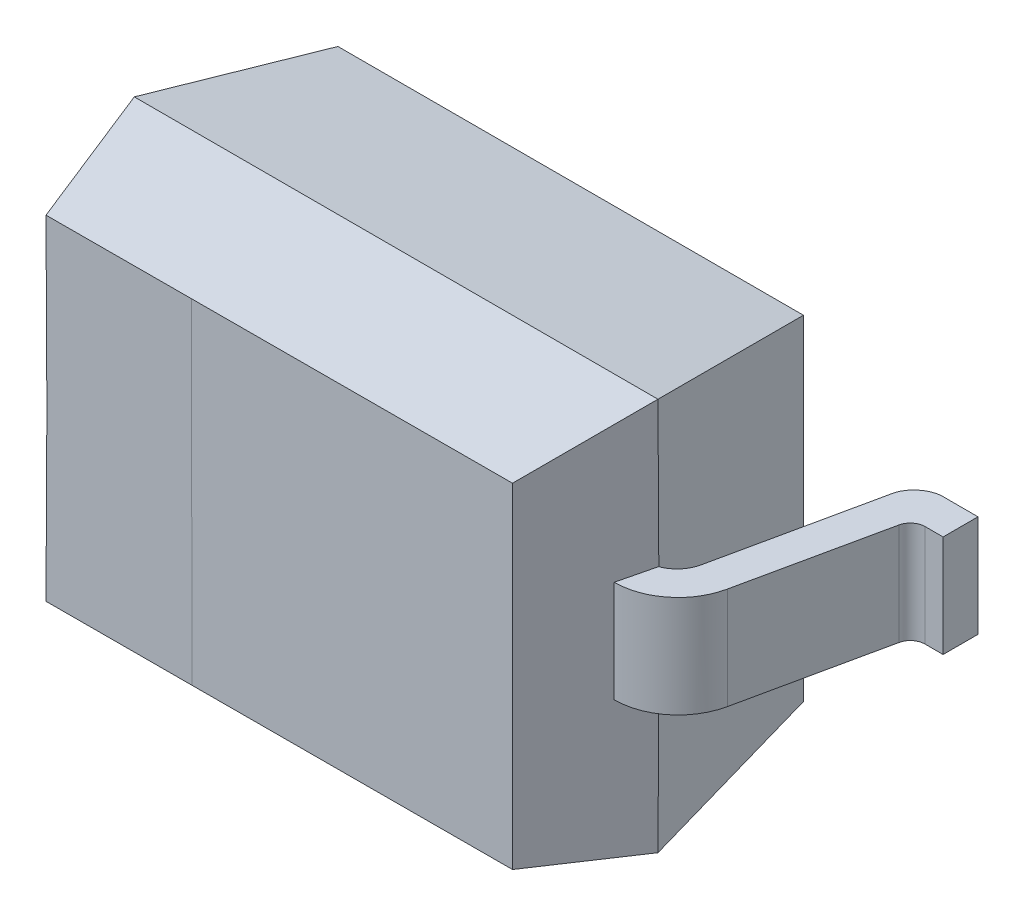
ISO-10303-21;
HEADER;
FILE_DESCRIPTION(('STEP AP214'),'2;1');
FILE_NAME('part.step','',(''),(''),'','','');
FILE_SCHEMA(('AUTOMOTIVE_DESIGN { 1 0 10303 214 1 1 1 1 }'));
ENDSEC;
DATA;
#1=APPLICATION_CONTEXT('core data for automotive mechanical design processes');
#2=APPLICATION_PROTOCOL_DEFINITION('international standard','automotive_design',2000,#1);
#3=PRODUCT_CONTEXT('',#1,'mechanical');
#4=PRODUCT('Part','Part','',(#3));
#5=PRODUCT_RELATED_PRODUCT_CATEGORY('part','',(#4));
#6=PRODUCT_DEFINITION_FORMATION('','',#4);
#7=PRODUCT_DEFINITION_CONTEXT('part definition',#1,'design');
#8=PRODUCT_DEFINITION('design','',#6,#7);
#9=PRODUCT_DEFINITION_SHAPE('','',#8);
#10=(LENGTH_UNIT() NAMED_UNIT(*) SI_UNIT(.MILLI.,.METRE.));
#11=(NAMED_UNIT(*) PLANE_ANGLE_UNIT() SI_UNIT($,.RADIAN.));
#12=(NAMED_UNIT(*) SI_UNIT($,.STERADIAN.) SOLID_ANGLE_UNIT());
#13=UNCERTAINTY_MEASURE_WITH_UNIT(LENGTH_MEASURE(1.E-05),#10,'distance_accuracy_value','');
#14=(GEOMETRIC_REPRESENTATION_CONTEXT(3) GLOBAL_UNCERTAINTY_ASSIGNED_CONTEXT((#13)) GLOBAL_UNIT_ASSIGNED_CONTEXT((#10,
#11,#12)) REPRESENTATION_CONTEXT('',''));
#15=CARTESIAN_POINT('',(0.,0.,0.));
#16=DIRECTION('',(0.,0.,1.));
#17=DIRECTION('',(1.,0.,0.));
#18=AXIS2_PLACEMENT_3D('',#15,#16,#17);
#19=CARTESIAN_POINT('',(0.,-0.543243243287611,-0.0905405405479329));
#20=DIRECTION('',(0.,0.986393923832144,0.164398987305358));
#21=DIRECTION('',(0.,-0.164398987305358,0.986393923832144));
#22=AXIS2_PLACEMENT_3D('',#19,#20,#21);
#23=PLANE('',#22);
#24=DIRECTION('',(1.,0.,0.));
#25=VECTOR('',#24,1.);
#26=CARTESIAN_POINT('',(0.,-0.575000000044456,0.0999999999931358));
#27=LINE('',#26,#25);
#28=CARTESIAN_POINT('',(0.799999999996665,-0.575000000042866,0.0999999999954248));
#29=VERTEX_POINT('',#28);
#30=CARTESIAN_POINT('',(-0.79999999999424,-0.575000000044456,0.0999999999954248));
#31=VERTEX_POINT('',#30);
#32=EDGE_CURVE('E193',#29,#31,#27,.F.);
#33=ORIENTED_EDGE('',*,*,#32,.F.);
#34=DIRECTION('',(-0.162221421363378,0.162221421124476,-0.973328526746854));
#35=VECTOR('',#34,1.);
#36=CARTESIAN_POINT('',(0.900000000150323,-0.675000000050845,0.700000000031467));
#37=LINE('',#36,#35);
#38=CARTESIAN_POINT('',(0.90000000016731,-0.675000000035285,0.700000000057761));
#39=VERTEX_POINT('',#38);
#40=EDGE_CURVE('E197',#39,#29,#37,.T.);
#41=ORIENTED_EDGE('',*,*,#40,.F.);
#42=DIRECTION('',(1.,0.,0.));
#43=VECTOR('',#42,1.);
#44=CARTESIAN_POINT('',(0.,-0.675000000027232,0.700000000025068));
#45=LINE('',#44,#43);
#46=CARTESIAN_POINT('',(-0.900000000179973,-0.675000000033437,0.700000000059475));
#47=VERTEX_POINT('',#46);
#48=EDGE_CURVE('E643',#47,#39,#45,.T.);
#49=ORIENTED_EDGE('',*,*,#48,.F.);
#50=DIRECTION('',(-0.162221421285356,-0.162221421126585,0.973328526759506));
#51=VECTOR('',#50,1.);
#52=CARTESIAN_POINT('',(-0.79999999999672,-0.57500000004486,0.0999999999955573));
#53=LINE('',#52,#51);
#54=EDGE_CURVE('E200',#31,#47,#53,.T.);
#55=ORIENTED_EDGE('',*,*,#54,.F.);
#56=EDGE_LOOP('',(#33,#41,#49,#55));
#57=FACE_BOUND('',#56,.T.);
#58=ADVANCED_FACE('F17',(#57),#23,.F.);
#59=CARTESIAN_POINT('',(-1.18084157899997,-0.174999999999953,0.100000000000038));
#60=DIRECTION('',(0.,1.,0.));
#61=DIRECTION('',(0.,0.,1.));
#62=AXIS2_PLACEMENT_3D('',#59,#60,#61);
#63=CYLINDRICAL_SURFACE('',#62,0.0999999996006633);
#64=CARTESIAN_POINT('',(-1.08306133768186,0.175000000000008,0.079047091083792));
#65=CARTESIAN_POINT('',(-1.09010125696182,0.175000000000008,0.0461941357109209));
#66=CARTESIAN_POINT('',(-1.1185163877309,0.175000000000008,0.0229045349440526));
#67=CARTESIAN_POINT('',(-1.14646170771199,0.175000000000008,3.51165589120538E-10));
#68=CARTESIAN_POINT('',(-1.18084157900002,0.175000000000008,1.99715244342258E-10));
#69=B_SPLINE_CURVE_WITH_KNOTS('',2,(#64,#65,#66,#67,#68),.UNSPECIFIED.,.F.,.F.,(3,2,3),(0.,0.5,
1.),.UNSPECIFIED.);
#70=CARTESIAN_POINT('',(-1.08306133762267,0.175000000000022,0.0790470910711083));
#71=VERTEX_POINT('',#70);
#72=CARTESIAN_POINT('',(-1.180841579,0.175000000000022,1.9970117681907E-10));
#73=VERTEX_POINT('',#72);
#74=EDGE_CURVE('E1323',#71,#73,#69,.T.);
#75=ORIENTED_EDGE('',*,*,#74,.F.);
#76=DIRECTION('',(0.,1.,0.));
#77=VECTOR('',#76,1.);
#78=CARTESIAN_POINT('',(-1.08306133713148,0.,0.0790470909658532));
#79=LINE('',#78,#77);
#80=CARTESIAN_POINT('',(-1.08306133762249,-0.174999999999995,0.0790470910710632));
#81=VERTEX_POINT('',#80);
#82=EDGE_CURVE('E645',#71,#81,#79,.F.);
#83=ORIENTED_EDGE('',*,*,#82,.T.);
#84=CARTESIAN_POINT('',(-1.18084157899997,-0.175000000000008,0.100000000000038));
#85=DIRECTION('',(0.,1.,0.));
#86=DIRECTION('',(0.977802413949638,0.,-0.209529089327143));
#87=AXIS2_PLACEMENT_3D('',#84,#85,#86);
#88=CIRCLE('',#87,0.0999999996006633);
#89=CARTESIAN_POINT('',(-1.18084157899997,-0.174999999999995,1.99496479448905E-10));
#90=VERTEX_POINT('',#89);
#91=EDGE_CURVE('E761',#81,#90,#88,.T.);
#92=ORIENTED_EDGE('',*,*,#91,.T.);
#93=DIRECTION('',(0.,1.,0.));
#94=VECTOR('',#93,1.);
#95=CARTESIAN_POINT('',(-1.18084157900002,0.,0.));
#96=LINE('',#95,#94);
#97=EDGE_CURVE('E223',#73,#90,#96,.F.);
#98=ORIENTED_EDGE('',*,*,#97,.F.);
#99=EDGE_LOOP('',(#75,#83,#92,#98));
#100=FACE_BOUND('',#99,.T.);
#101=ADVANCED_FACE('F652',(#100),#63,.T.);
#102=CARTESIAN_POINT('',(0.,0.,0.));
#103=DIRECTION('',(0.,0.,-1.));
#104=DIRECTION('',(0.,1.,0.));
#105=AXIS2_PLACEMENT_3D('',#102,#103,#104);
#106=PLANE('',#105);
#107=DIRECTION('',(1.,0.,0.));
#108=VECTOR('',#107,1.);
#109=CARTESIAN_POINT('',(0.,0.175000000000008,1.99715244342258E-10));
#110=LINE('',#109,#108);
#111=CARTESIAN_POINT('',(-1.30000000000001,0.175000000000027,1.33145809192807E-10));
#112=VERTEX_POINT('',#111);
#113=EDGE_CURVE('E755',#73,#112,#110,.F.);
#114=ORIENTED_EDGE('',*,*,#113,.F.);
#115=ORIENTED_EDGE('',*,*,#97,.T.);
#116=DIRECTION('',(1.,0.,0.));
#117=VECTOR('',#116,1.);
#118=CARTESIAN_POINT('',(0.,-0.174999999999981,1.99305849601927E-10));
#119=LINE('',#118,#117);
#120=CARTESIAN_POINT('',(-1.29999999999997,-0.174999999999981,1.3287287936592E-10));
#121=VERTEX_POINT('',#120);
#122=EDGE_CURVE('E742',#90,#121,#119,.F.);
#123=ORIENTED_EDGE('',*,*,#122,.T.);
#124=DIRECTION('',(0.,1.,0.));
#125=VECTOR('',#124,1.);
#126=CARTESIAN_POINT('',(-1.30000000000001,0.,0.));
#127=LINE('',#126,#125);
#128=EDGE_CURVE('E735',#121,#112,#127,.T.);
#129=ORIENTED_EDGE('',*,*,#128,.T.);
#130=EDGE_LOOP('',(#114,#115,#123,#129));
#131=FACE_BOUND('',#130,.T.);
#132=ADVANCED_FACE('F661',(#131),#106,.T.);
#133=CARTESIAN_POINT('',(-1.30000000000001,0.,0.));
#134=DIRECTION('',(1.,0.,0.));
#135=DIRECTION('',(0.,1.,0.));
#136=AXIS2_PLACEMENT_3D('',#133,#134,#135);
#137=PLANE('',#136);
#138=DIRECTION('',(0.,-1.,0.));
#139=VECTOR('',#138,1.);
#140=CARTESIAN_POINT('',(-1.29999999999998,0.,0.119999999999995));
#141=LINE('',#140,#139);
#142=CARTESIAN_POINT('',(-1.3,0.175000000000018,0.120000000000012));
#143=VERTEX_POINT('',#142);
#144=CARTESIAN_POINT('',(-1.29999999999996,-0.174999999999981,0.120000000000009));
#145=VERTEX_POINT('',#144);
#146=EDGE_CURVE('E731',#143,#145,#141,.T.);
#147=ORIENTED_EDGE('',*,*,#146,.F.);
#148=DIRECTION('',(0.,0.,1.));
#149=VECTOR('',#148,1.);
#150=CARTESIAN_POINT('',(-1.30000000000001,0.175000000000008,0.));
#151=LINE('',#150,#149);
#152=EDGE_CURVE('E703',#112,#143,#151,.T.);
#153=ORIENTED_EDGE('',*,*,#152,.F.);
#154=ORIENTED_EDGE('',*,*,#128,.F.);
#155=DIRECTION('',(0.,0.,1.));
#156=VECTOR('',#155,1.);
#157=CARTESIAN_POINT('',(-1.29999999999995,-0.174999999999981,0.));
#158=LINE('',#157,#156);
#159=EDGE_CURVE('E738',#121,#145,#158,.T.);
#160=ORIENTED_EDGE('',*,*,#159,.T.);
#161=EDGE_LOOP('',(#147,#153,#154,#160));
#162=FACE_BOUND('',#161,.T.);
#163=ADVANCED_FACE('F1249',(#162),#137,.F.);
#164=CARTESIAN_POINT('',(0.,0.,0.119999999999995));
#165=DIRECTION('',(0.,0.,1.));
#166=DIRECTION('',(0.,-1.,0.));
#167=AXIS2_PLACEMENT_3D('',#164,#165,#166);
#168=PLANE('',#167);
#169=DIRECTION('',(1.,0.,0.));
#170=VECTOR('',#169,1.);
#171=CARTESIAN_POINT('',(0.,0.175000000000008,0.12000000000003));
#172=LINE('',#171,#170);
#173=CARTESIAN_POINT('',(-1.23743068399924,0.175000000000022,0.120000000434861));
#174=VERTEX_POINT('',#173);
#175=EDGE_CURVE('E1314',#143,#174,#172,.T.);
#176=ORIENTED_EDGE('',*,*,#175,.F.);
#177=ORIENTED_EDGE('',*,*,#146,.T.);
#178=DIRECTION('',(1.,0.,0.));
#179=VECTOR('',#178,1.);
#180=CARTESIAN_POINT('',(0.,-0.174999999999981,0.120000000000016));
#181=LINE('',#180,#179);
#182=CARTESIAN_POINT('',(-1.23743068399998,-0.174999999999953,0.120000000434958));
#183=VERTEX_POINT('',#182);
#184=EDGE_CURVE('E741',#145,#183,#181,.T.);
#185=ORIENTED_EDGE('',*,*,#184,.T.);
#186=DIRECTION('',(0.,1.,0.));
#187=VECTOR('',#186,1.);
#188=CARTESIAN_POINT('',(-1.23743068399998,-0.174999999999981,0.120000000695921));
#189=LINE('',#188,#187);
#190=EDGE_CURVE('E723',#183,#174,#189,.T.);
#191=ORIENTED_EDGE('',*,*,#190,.T.);
#192=EDGE_LOOP('',(#176,#177,#185,#191));
#193=FACE_BOUND('',#192,.T.);
#194=ADVANCED_FACE('F714',(#193),#168,.T.);
#195=CARTESIAN_POINT('',(-1.23743068399995,-0.174999999999981,0.170000000000017));
#196=DIRECTION('',(0.,1.,0.));
#197=DIRECTION('',(0.,0.,1.));
#198=AXIS2_PLACEMENT_3D('',#195,#196,#197);
#199=CYLINDRICAL_SURFACE('',#198,0.0499999993040961);
#200=DIRECTION('',(0.,1.,0.));
#201=VECTOR('',#200,1.);
#202=CARTESIAN_POINT('',(-1.18854056314266,0.,0.159523545445349));
#203=LINE('',#202,#201);
#204=CARTESIAN_POINT('',(-1.18854056369606,0.175000000000036,0.159523545563934));
#205=VERTEX_POINT('',#204);
#206=CARTESIAN_POINT('',(-1.18854056369629,-0.174999999999953,0.159523545563222));
#207=VERTEX_POINT('',#206);
#208=EDGE_CURVE('E591',#205,#207,#203,.F.);
#209=ORIENTED_EDGE('',*,*,#208,.F.);
#210=CARTESIAN_POINT('',(-1.23743068399849,0.175000000000008,0.120000000173801));
#211=CARTESIAN_POINT('',(-1.22046761095308,0.175000000000008,0.120203477150958));
#212=CARTESIAN_POINT('',(-1.20626808869845,0.175000000000008,0.131452267780261));
#213=CARTESIAN_POINT('',(-1.19242017377343,0.175000000000008,0.142422516838693));
#214=CARTESIAN_POINT('',(-1.18854056382378,0.175000000000008,0.159523545591303));
#215=B_SPLINE_CURVE_WITH_KNOTS('',2,(#210,#211,#212,#213,#214),.UNSPECIFIED.,.F.,.F.,(3,2,3),
(0.,0.5,1.),.UNSPECIFIED.);
#216=EDGE_CURVE('E698',#174,#205,#215,.T.);
#217=ORIENTED_EDGE('',*,*,#216,.F.);
#218=ORIENTED_EDGE('',*,*,#190,.F.);
#219=CARTESIAN_POINT('',(-1.23743068399995,-0.174999999999925,0.170000000000017));
#220=DIRECTION('',(0.,-1.,0.));
#221=DIRECTION('',(-5.55111520038664E-13,0.,-1.));
#222=AXIS2_PLACEMENT_3D('',#219,#220,#221);
#223=CIRCLE('',#222,0.0499999993040961);
#224=EDGE_CURVE('E1370',#183,#207,#223,.T.);
#225=ORIENTED_EDGE('',*,*,#224,.T.);
#226=EDGE_LOOP('',(#209,#217,#218,#225));
#227=FACE_BOUND('',#226,.T.);
#228=ADVANCED_FACE('F704',(#227),#199,.F.);
#229=CARTESIAN_POINT('',(-1.16904360627858,0.,0.250509344159926));
#230=DIRECTION('',(-0.977802414084726,0.,0.209529088696729));
#231=DIRECTION('',(0.209529088696729,0.,0.977802414084726));
#232=AXIS2_PLACEMENT_3D('',#229,#230,#231);
#233=PLANE('',#232);
#234=DIRECTION('',(0.209529089204606,0.,0.977802413975895));
#235=VECTOR('',#234,1.);
#236=CARTESIAN_POINT('',(-1.18854056382378,0.175000000000008,0.159523545591303));
#237=LINE('',#236,#235);
#238=CARTESIAN_POINT('',(-1.0842749520122,0.175000000000008,0.646096399502248));
#239=VERTEX_POINT('',#238);
#240=EDGE_CURVE('E1316',#205,#239,#237,.T.);
#241=ORIENTED_EDGE('',*,*,#240,.F.);
#242=ORIENTED_EDGE('',*,*,#208,.T.);
#243=DIRECTION('',(0.209529089203297,0.,0.977802413976176));
#244=VECTOR('',#243,1.);
#245=CARTESIAN_POINT('',(-1.18854056382425,-0.174999999999981,0.159523545589881));
#246=LINE('',#245,#244);
#247=CARTESIAN_POINT('',(-1.08427495201277,-0.174999999999939,0.646096399501571));
#248=VERTEX_POINT('',#247);
#249=EDGE_CURVE('E1337',#207,#248,#246,.T.);
#250=ORIENTED_EDGE('',*,*,#249,.T.);
#251=DIRECTION('',(0.,1.,0.));
#252=VECTOR('',#251,1.);
#253=CARTESIAN_POINT('',(-1.08427495200008,-0.174999999999925,0.646096399499651));
#254=LINE('',#253,#252);
#255=EDGE_CURVE('E767',#239,#248,#254,.F.);
#256=ORIENTED_EDGE('',*,*,#255,.F.);
#257=EDGE_LOOP('',(#241,#242,#250,#256));
#258=FACE_BOUND('',#257,.T.);
#259=ADVANCED_FACE('F713',(#258),#233,.T.);
#260=CARTESIAN_POINT('',(1.16904360627858,0.,0.250509344159856));
#261=DIRECTION('',(-0.977802414084726,0.,-0.209529088696729));
#262=DIRECTION('',(-0.209529088696729,0.,0.977802414084726));
#263=AXIS2_PLACEMENT_3D('',#260,#261,#262);
#264=PLANE('',#263);
#265=DIRECTION('',(0.,1.,0.));
#266=VECTOR('',#265,1.);
#267=CARTESIAN_POINT('',(1.18854056331364,-0.175000000000064,0.159523545481949));
#268=LINE('',#267,#266);
#269=CARTESIAN_POINT('',(1.18854056339857,-0.174999999999995,0.159523545500148));
#270=VERTEX_POINT('',#269);
#271=CARTESIAN_POINT('',(1.18854056339882,0.174999999999981,0.159523545499451));
#272=VERTEX_POINT('',#271);
#273=EDGE_CURVE('E582',#270,#272,#268,.T.);
#274=ORIENTED_EDGE('',*,*,#273,.T.);
#275=DIRECTION('',(0.209529088421917,0.,-0.977802414143615));
#276=VECTOR('',#275,1.);
#277=CARTESIAN_POINT('',(1.08427495207403,0.175000000000008,0.646096399513893));
#278=LINE('',#277,#276);
#279=CARTESIAN_POINT('',(1.08427495208555,0.174999999999967,0.646096399517164));
#280=VERTEX_POINT('',#279);
#281=EDGE_CURVE('E407',#280,#272,#278,.T.);
#282=ORIENTED_EDGE('',*,*,#281,.F.);
#283=DIRECTION('',(0.,1.,0.));
#284=VECTOR('',#283,1.);
#285=CARTESIAN_POINT('',(1.08427495209707,-0.175000000000175,0.646096399520435));
#286=LINE('',#285,#284);
#287=CARTESIAN_POINT('',(1.08427495208497,-0.174999999999967,0.64609639951784));
#288=VERTEX_POINT('',#287);
#289=EDGE_CURVE('E409',#288,#280,#286,.T.);
#290=ORIENTED_EDGE('',*,*,#289,.F.);
#291=DIRECTION('',(0.209529088423214,0.,-0.977802414143337));
#292=VECTOR('',#291,1.);
#293=CARTESIAN_POINT('',(1.08427495207286,-0.174999999999981,0.646096399515246));
#294=LINE('',#293,#292);
#295=EDGE_CURVE('E503',#288,#270,#294,.T.);
#296=ORIENTED_EDGE('',*,*,#295,.T.);
#297=EDGE_LOOP('',(#274,#282,#290,#296));
#298=FACE_BOUND('',#297,.T.);
#299=ADVANCED_FACE('F572',(#298),#264,.F.);
#300=CARTESIAN_POINT('',(1.23743068400003,-0.175000000000064,0.170000000000045));
#301=DIRECTION('',(0.,1.,0.));
#302=DIRECTION('',(0.,0.,1.));
#303=AXIS2_PLACEMENT_3D('',#300,#301,#302);
#304=CYLINDRICAL_SURFACE('',#303,0.05);
#305=DIRECTION('',(0.,-1.,0.));
#306=VECTOR('',#305,1.);
#307=CARTESIAN_POINT('',(1.23743068400002,0.,0.119999999999995));
#308=LINE('',#307,#306);
#309=CARTESIAN_POINT('',(1.23743068400002,0.174999999999995,0.120000000000035));
#310=VERTEX_POINT('',#309);
#311=CARTESIAN_POINT('',(1.23743068399928,-0.174999999999995,0.119999999999931));
#312=VERTEX_POINT('',#311);
#313=EDGE_CURVE('E590',#310,#312,#308,.T.);
#314=ORIENTED_EDGE('',*,*,#313,.F.);
#315=CARTESIAN_POINT('',(1.188540563484,0.175000000000008,0.159523545516953));
#316=CARTESIAN_POINT('',(1.19229378058126,0.175000000000008,0.142979645787936));
#317=CARTESIAN_POINT('',(1.20626808830757,0.175000000000008,0.131452267317973));
#318=CARTESIAN_POINT('',(1.21989636538779,0.175000000000008,0.120210328835293));
#319=CARTESIAN_POINT('',(1.23743068400002,0.175000000000008,0.120000000000051));
#320=B_SPLINE_CURVE_WITH_KNOTS('',2,(#315,#316,#317,#318,#319),.UNSPECIFIED.,.F.,.F.,(3,2,3),
(0.,0.5,1.),.UNSPECIFIED.);
#321=EDGE_CURVE('E404',#272,#310,#320,.T.);
#322=ORIENTED_EDGE('',*,*,#321,.F.);
#323=ORIENTED_EDGE('',*,*,#273,.F.);
#324=CARTESIAN_POINT('',(1.23743068400003,-0.175000000000008,0.170000000000045));
#325=DIRECTION('',(0.,-1.,0.));
#326=DIRECTION('',(-0.977802413727901,0.,-0.209529090361915));
#327=AXIS2_PLACEMENT_3D('',#324,#325,#326);
#328=CIRCLE('',#327,0.0500000000000001);
#329=EDGE_CURVE('E554',#270,#312,#328,.T.);
#330=ORIENTED_EDGE('',*,*,#329,.T.);
#331=EDGE_LOOP('',(#314,#322,#323,#330));
#332=FACE_BOUND('',#331,.T.);
#333=ADVANCED_FACE('F561',(#332),#304,.F.);
#334=CARTESIAN_POINT('',(0.,0.,0.119999999999995));
#335=DIRECTION('',(0.,0.,1.));
#336=DIRECTION('',(0.,-1.,0.));
#337=AXIS2_PLACEMENT_3D('',#334,#335,#336);
#338=PLANE('',#337);
#339=DIRECTION('',(1.,0.,0.));
#340=VECTOR('',#339,1.);
#341=CARTESIAN_POINT('',(0.,0.175000000000008,0.120000000000051));
#342=LINE('',#341,#340);
#343=CARTESIAN_POINT('',(1.30000000000003,0.175000000000008,0.120000000000051));
#344=VERTEX_POINT('',#343);
#345=EDGE_CURVE('E402',#310,#344,#342,.T.);
#346=ORIENTED_EDGE('',*,*,#345,.F.);
#347=ORIENTED_EDGE('',*,*,#313,.T.);
#348=DIRECTION('',(1.,0.,0.));
#349=VECTOR('',#348,1.);
#350=CARTESIAN_POINT('',(0.,-0.174999999999981,0.119999999999842));
#351=LINE('',#350,#349);
#352=CARTESIAN_POINT('',(1.30000000000002,-0.174999999999981,0.119999999999912));
#353=VERTEX_POINT('',#352);
#354=EDGE_CURVE('E546',#312,#353,#351,.T.);
#355=ORIENTED_EDGE('',*,*,#354,.T.);
#356=DIRECTION('',(0.,1.,0.));
#357=VECTOR('',#356,1.);
#358=CARTESIAN_POINT('',(1.30000000000001,0.,0.120000000000051));
#359=LINE('',#358,#357);
#360=EDGE_CURVE('E615',#344,#353,#359,.F.);
#361=ORIENTED_EDGE('',*,*,#360,.F.);
#362=EDGE_LOOP('',(#346,#347,#355,#361));
#363=FACE_BOUND('',#362,.T.);
#364=ADVANCED_FACE('F571',(#363),#338,.T.);
#365=CARTESIAN_POINT('',(1.30000000000001,0.,0.));
#366=DIRECTION('',(1.,0.,0.));
#367=DIRECTION('',(0.,1.,0.));
#368=AXIS2_PLACEMENT_3D('',#365,#366,#367);
#369=PLANE('',#368);
#370=DIRECTION('',(0.,0.,1.));
#371=VECTOR('',#370,1.);
#372=CARTESIAN_POINT('',(1.30000000000004,0.175000000000008,0.));
#373=LINE('',#372,#371);
#374=CARTESIAN_POINT('',(1.30000000000001,0.175000000000008,0.));
#375=VERTEX_POINT('',#374);
#376=EDGE_CURVE('E399',#344,#375,#373,.F.);
#377=ORIENTED_EDGE('',*,*,#376,.F.);
#378=ORIENTED_EDGE('',*,*,#360,.T.);
#379=DIRECTION('',(0.,0.,1.));
#380=VECTOR('',#379,1.);
#381=CARTESIAN_POINT('',(1.30000000000002,-0.174999999999981,0.));
#382=LINE('',#381,#380);
#383=CARTESIAN_POINT('',(1.3,-0.174999999999999,0.));
#384=VERTEX_POINT('',#383);
#385=EDGE_CURVE('E537',#353,#384,#382,.F.);
#386=ORIENTED_EDGE('',*,*,#385,.T.);
#387=DIRECTION('',(0.,1.,0.));
#388=VECTOR('',#387,1.);
#389=CARTESIAN_POINT('',(1.29999999999995,0.,0.));
#390=LINE('',#389,#388);
#391=EDGE_CURVE('E620',#375,#384,#390,.F.);
#392=ORIENTED_EDGE('',*,*,#391,.F.);
#393=EDGE_LOOP('',(#377,#378,#386,#392));
#394=FACE_BOUND('',#393,.T.);
#395=ADVANCED_FACE('F623',(#394),#369,.T.);
#396=CARTESIAN_POINT('',(0.,0.,0.));
#397=DIRECTION('',(0.,0.,-1.));
#398=DIRECTION('',(0.,1.,0.));
#399=AXIS2_PLACEMENT_3D('',#396,#397,#398);
#400=PLANE('',#399);
#401=DIRECTION('',(1.,0.,0.));
#402=VECTOR('',#401,1.);
#403=CARTESIAN_POINT('',(0.,0.175000000000008,0.));
#404=LINE('',#403,#402);
#405=CARTESIAN_POINT('',(1.18084157899996,0.175000000000008,-1.89383014478905E-13));
#406=VERTEX_POINT('',#405);
#407=EDGE_CURVE('E390',#375,#406,#404,.F.);
#408=ORIENTED_EDGE('',*,*,#407,.F.);
#409=ORIENTED_EDGE('',*,*,#391,.T.);
#410=DIRECTION('',(1.,0.,0.));
#411=VECTOR('',#410,1.);
#412=CARTESIAN_POINT('',(0.,-0.174999999999981,0.));
#413=LINE('',#412,#411);
#414=CARTESIAN_POINT('',(1.18084157900001,-0.174999999999953,0.));
#415=VERTEX_POINT('',#414);
#416=EDGE_CURVE('E545',#384,#415,#413,.F.);
#417=ORIENTED_EDGE('',*,*,#416,.T.);
#418=DIRECTION('',(0.,1.,0.));
#419=VECTOR('',#418,1.);
#420=CARTESIAN_POINT('',(1.18084157899996,-0.175000000000008,0.));
#421=LINE('',#420,#419);
#422=EDGE_CURVE('E515',#406,#415,#421,.F.);
#423=ORIENTED_EDGE('',*,*,#422,.F.);
#424=EDGE_LOOP('',(#408,#409,#417,#423));
#425=FACE_BOUND('',#424,.T.);
#426=ADVANCED_FACE('F527',(#425),#400,.T.);
#427=CARTESIAN_POINT('',(1.18084157900003,-0.175000000000008,0.0999999999999959));
#428=DIRECTION('',(0.,1.,0.));
#429=DIRECTION('',(0.,0.,1.));
#430=AXIS2_PLACEMENT_3D('',#427,#428,#429);
#431=CYLINDRICAL_SURFACE('',#430,0.1);
#432=CARTESIAN_POINT('',(1.18084157899996,0.175000000000008,-3.7470027081099E-13));
#433=CARTESIAN_POINT('',(1.14724281194758,0.175000000000008,-3.7470027081099E-13));
#434=CARTESIAN_POINT('',(1.11851638751861,0.175000000000008,0.0229045346688895));
#435=CARTESIAN_POINT('',(1.09026492076373,0.175000000000008,0.0454303697704601));
#436=CARTESIAN_POINT('',(1.08306133758389,0.175000000000008,0.0790470910627811));
#437=B_SPLINE_CURVE_WITH_KNOTS('',2,(#432,#433,#434,#435,#436),.UNSPECIFIED.,.F.,.F.,(3,2,3),
(0.,0.5,1.),.UNSPECIFIED.);
#438=CARTESIAN_POINT('',(1.08306133747608,0.174999999999995,0.079047091039682));
#439=VERTEX_POINT('',#438);
#440=EDGE_CURVE('E385',#406,#439,#437,.T.);
#441=ORIENTED_EDGE('',*,*,#440,.F.);
#442=ORIENTED_EDGE('',*,*,#422,.T.);
#443=CARTESIAN_POINT('',(1.18084157900003,-0.174999999999925,0.0999999999999959));
#444=DIRECTION('',(0.,1.,0.));
#445=DIRECTION('',(-6.93889390390723E-13,0.,-1.));
#446=AXIS2_PLACEMENT_3D('',#443,#444,#445);
#447=CIRCLE('',#446,0.1);
#448=CARTESIAN_POINT('',(1.08306133747627,-0.174999999999967,0.0790470910397271));
#449=VERTEX_POINT('',#448);
#450=EDGE_CURVE('E1019',#415,#449,#447,.T.);
#451=ORIENTED_EDGE('',*,*,#450,.T.);
#452=DIRECTION('',(0.,1.,0.));
#453=VECTOR('',#452,1.);
#454=CARTESIAN_POINT('',(1.08306133713149,0.,0.0790470909658386));
#455=LINE('',#454,#453);
#456=EDGE_CURVE('E501',#439,#449,#455,.F.);
#457=ORIENTED_EDGE('',*,*,#456,.F.);
#458=EDGE_LOOP('',(#441,#442,#451,#457));
#459=FACE_BOUND('',#458,.T.);
#460=ADVANCED_FACE('F517',(#459),#431,.T.);
#461=CARTESIAN_POINT('',(0.,-0.800000000024254,0.199999999985448));
#462=DIRECTION('',(0.,-0.970142500151214,0.242535625012805));
#463=DIRECTION('',(0.,-0.242535625012805,-0.970142500151214));
#464=AXIS2_PLACEMENT_3D('',#461,#462,#463);
#465=PLANE('',#464);
#466=ORIENTED_EDGE('',*,*,#48,.T.);
#467=DIRECTION('',(-0.235702260744723,0.235702260352109,0.942809041505613));
#468=VECTOR('',#467,1.);
#469=CARTESIAN_POINT('',(0.900000000150323,-0.67500000002565,0.700000000031397));
#470=LINE('',#469,#468);
#471=CARTESIAN_POINT('',(0.80000000030565,-0.575000000042519,1.10000000002736));
#472=VERTEX_POINT('',#471);
#473=EDGE_CURVE('E644',#39,#472,#470,.T.);
#474=ORIENTED_EDGE('',*,*,#473,.T.);
#475=CARTESIAN_POINT('',(0.800000000407485,-0.575000000043663,1.10000000000058));
#476=DIRECTION('',(-1.,0.,0.));
#477=VECTOR('',#476,1.);
#478=LINE('',#475,#477);
#479=CARTESIAN_POINT('',(-0.299999999995708,-0.574973397833814,1.10243444286103));
#480=VERTEX_POINT('',#479);
#481=EDGE_CURVE('E367',#472,#480,#478,.T.);
#482=ORIENTED_EDGE('',*,*,#481,.T.);
#483=CARTESIAN_POINT('',(-0.299999999907842,-0.574411764747152,1.10235294118686));
#484=DIRECTION('',(-1.,0.,0.));
#485=VECTOR('',#484,1.);
#486=LINE('',#483,#485);
#487=CARTESIAN_POINT('',(-0.799842843870484,-0.574770860654343,1.10360309864909));
#488=VERTEX_POINT('',#487);
#489=EDGE_CURVE('E638',#480,#488,#486,.T.);
#490=ORIENTED_EDGE('',*,*,#489,.T.);
#491=CARTESIAN_POINT('',(-0.800000000071725,-0.574411764747152,1.10235294118686));
#492=DIRECTION('',(-0.234399827596686,-0.23577865001376,-0.943114600152247));
#493=VECTOR('',#492,1.);
#494=LINE('',#491,#493);
#495=EDGE_CURVE('E230',#488,#47,#494,.T.);
#496=ORIENTED_EDGE('',*,*,#495,.T.);
#497=EDGE_LOOP('',(#466,#474,#482,#490,#496));
#498=FACE_BOUND('',#497,.T.);
#499=ADVANCED_FACE('F526',(#498),#465,.T.);
#500=CARTESIAN_POINT('',(-1.05170731659023,0.,0.225365853516665));
#501=DIRECTION('',(-0.977802414084726,0.,0.209529088696729));
#502=DIRECTION('',(0.209529088696729,0.,0.977802414084726));
#503=AXIS2_PLACEMENT_3D('',#500,#501,#502);
#504=PLANE('',#503);
#505=ORIENTED_EDGE('',*,*,#82,.F.);
#506=DIRECTION('',(-0.209529088790632,0.,-0.977802414064604));
#507=VECTOR('',#506,1.);
#508=CARTESIAN_POINT('',(-0.966938662402494,0.175000000000008,0.620952908892539));
#509=LINE('',#508,#507);
#510=CARTESIAN_POINT('',(-0.966938662402068,0.174999999999953,0.620952908892447));
#511=VERTEX_POINT('',#510);
#512=EDGE_CURVE('E355',#511,#71,#509,.T.);
#513=ORIENTED_EDGE('',*,*,#512,.F.);
#514=DIRECTION('',(0.,1.,0.));
#515=VECTOR('',#514,1.);
#516=CARTESIAN_POINT('',(-0.966938662401641,-0.174999999999925,0.620952908892356));
#517=LINE('',#516,#515);
#518=CARTESIAN_POINT('',(-0.966938662401735,-0.174999999999953,0.620952908893374));
#519=VERTEX_POINT('',#518);
#520=EDGE_CURVE('E362',#511,#519,#517,.F.);
#521=ORIENTED_EDGE('',*,*,#520,.T.);
#522=DIRECTION('',(-0.209529088790416,0.,-0.977802414064651));
#523=VECTOR('',#522,1.);
#524=CARTESIAN_POINT('',(-0.966938662401828,-0.174999999999981,0.620952908894391));
#525=LINE('',#524,#523);
#526=EDGE_CURVE('E766',#519,#81,#525,.T.);
#527=ORIENTED_EDGE('',*,*,#526,.T.);
#528=EDGE_LOOP('',(#505,#513,#521,#527));
#529=FACE_BOUND('',#528,.T.);
#530=ADVANCED_FACE('F323',(#529),#504,.F.);
#531=CARTESIAN_POINT('',(0.,0.175000000000008,0.));
#532=DIRECTION('',(0.,1.,0.));
#533=DIRECTION('',(0.,0.,1.));
#534=AXIS2_PLACEMENT_3D('',#531,#532,#533);
#535=PLANE('',#534);
#536=CARTESIAN_POINT('',(-0.90052180607626,0.174999999999898,0.697912777385243));
#537=DIRECTION('',(0.242535625012806,0.,0.970142500151214));
#538=VECTOR('',#537,1.);
#539=LINE('',#536,#538);
#540=CARTESIAN_POINT('',(-0.899622812819565,0.175000157013672,0.696743796563826));
#541=VERTEX_POINT('',#540);
#542=CARTESIAN_POINT('',(-0.869750327648232,0.174999999999972,0.820112952108348));
#543=VERTEX_POINT('',#542);
#544=EDGE_CURVE('E304',#541,#543,#539,.T.);
#545=ORIENTED_EDGE('',*,*,#544,.F.);
#546=CARTESIAN_POINT('',(-0.899614317742672,0.175000000000008,0.697685905259371));
#547=CARTESIAN_POINT('',(-0.924440213073346,0.175000000000008,0.68803326795143));
#548=CARTESIAN_POINT('',(-0.942939100161144,0.175000000000008,0.667374738457829));
#549=CARTESIAN_POINT('',(-0.961411653509485,0.175000000000008,0.646745617021624));
#550=CARTESIAN_POINT('',(-0.966938662402494,0.175000000000008,0.620952908892539));
#551=B_SPLINE_CURVE_WITH_KNOTS('',2,(#546,#547,#548,#549,#550),.UNSPECIFIED.,.F.,.F.,(3,2,3),
(0.,0.5,1.),.UNSPECIFIED.);
#552=EDGE_CURVE('E354',#541,#511,#551,.T.);
#553=ORIENTED_EDGE('',*,*,#552,.T.);
#554=ORIENTED_EDGE('',*,*,#512,.T.);
#555=ORIENTED_EDGE('',*,*,#74,.T.);
#556=ORIENTED_EDGE('',*,*,#113,.T.);
#557=ORIENTED_EDGE('',*,*,#152,.T.);
#558=ORIENTED_EDGE('',*,*,#175,.T.);
#559=ORIENTED_EDGE('',*,*,#216,.T.);
#560=ORIENTED_EDGE('',*,*,#240,.T.);
#561=CARTESIAN_POINT('',(-0.869158420999994,0.175000000000008,0.600000000000045));
#562=DIRECTION('',(0.,-1.,0.));
#563=DIRECTION('',(-0.00179935719829059,0.,0.999998381155526));
#564=AXIS2_PLACEMENT_3D('',#561,#562,#563);
#565=CIRCLE('',#564,0.219999999900767);
#566=EDGE_CURVE('E684',#543,#239,#565,.T.);
#567=ORIENTED_EDGE('',*,*,#566,.F.);
#568=EDGE_LOOP('',(#545,#553,#554,#555,#556,#557,#558,#559,#560,#567));
#569=FACE_BOUND('',#568,.T.);
#570=ADVANCED_FACE('F312',(#569),#535,.T.);
#571=CARTESIAN_POINT('',(-0.869158420999994,-0.174999999999925,0.600000000000045));
#572=DIRECTION('',(0.,1.,0.));
#573=DIRECTION('',(0.,0.,1.));
#574=AXIS2_PLACEMENT_3D('',#571,#572,#573);
#575=CYLINDRICAL_SURFACE('',#574,0.219999999900767);
#576=ORIENTED_EDGE('',*,*,#566,.T.);
#577=ORIENTED_EDGE('',*,*,#255,.T.);
#578=CARTESIAN_POINT('',(-0.869158420999994,-0.174999999999897,0.600000000000045));
#579=DIRECTION('',(0.,1.,0.));
#580=DIRECTION('',(-0.977802414077793,0.,0.209529088729081));
#581=AXIS2_PLACEMENT_3D('',#578,#579,#580);
#582=CIRCLE('',#581,0.219999999900767);
#583=CARTESIAN_POINT('',(-0.869750327648377,-0.174999999999951,0.82011295210837));
#584=VERTEX_POINT('',#583);
#585=EDGE_CURVE('E504',#248,#584,#582,.T.);
#586=ORIENTED_EDGE('',*,*,#585,.T.);
#587=CARTESIAN_POINT('',(-0.869950495761396,0.174999999999898,0.820198018657302));
#588=DIRECTION('',(0.,-1.,0.));
#589=VECTOR('',#588,1.);
#590=LINE('',#587,#589);
#591=EDGE_CURVE('E779',#543,#584,#590,.T.);
#592=ORIENTED_EDGE('',*,*,#591,.F.);
#593=EDGE_LOOP('',(#576,#577,#586,#592));
#594=FACE_BOUND('',#593,.T.);
#595=ADVANCED_FACE('F322',(#594),#575,.T.);
#596=CARTESIAN_POINT('',(0.,-0.174999999999981,0.));
#597=DIRECTION('',(0.,1.,0.));
#598=DIRECTION('',(0.,0.,1.));
#599=AXIS2_PLACEMENT_3D('',#596,#597,#598);
#600=PLANE('',#599);
#601=ORIENTED_EDGE('',*,*,#249,.F.);
#602=ORIENTED_EDGE('',*,*,#224,.F.);
#603=ORIENTED_EDGE('',*,*,#184,.F.);
#604=ORIENTED_EDGE('',*,*,#159,.F.);
#605=ORIENTED_EDGE('',*,*,#122,.F.);
#606=ORIENTED_EDGE('',*,*,#91,.F.);
#607=ORIENTED_EDGE('',*,*,#526,.F.);
#608=CARTESIAN_POINT('',(-0.966938662401828,-0.174999999999981,0.620952908894391));
#609=CARTESIAN_POINT('',(-0.961411653509271,-0.174999999999981,0.646745617022308));
#610=CARTESIAN_POINT('',(-0.942939100160892,-0.174999999999981,0.667374738458088));
#611=CARTESIAN_POINT('',(-0.924440213072778,-0.174999999999981,0.688033267951575));
#612=CARTESIAN_POINT('',(-0.899614317741326,-0.174999999999981,0.697685905259593));
#613=B_SPLINE_CURVE_WITH_KNOTS('',2,(#608,#609,#610,#611,#612),.UNSPECIFIED.,.F.,.F.,(3,2,3),
(0.,0.5,1.),.UNSPECIFIED.);
#614=CARTESIAN_POINT('',(-0.899622813015713,-0.175000000003558,0.696743795961215));
#615=VERTEX_POINT('',#614);
#616=EDGE_CURVE('E365',#519,#615,#613,.T.);
#617=ORIENTED_EDGE('',*,*,#616,.T.);
#618=CARTESIAN_POINT('',(-0.869950495761396,-0.174999999999981,0.820198018657302));
#619=DIRECTION('',(-0.242535625012805,0.,-0.970142500151214));
#620=VECTOR('',#619,1.);
#621=LINE('',#618,#620);
#622=EDGE_CURVE('E776',#584,#615,#621,.T.);
#623=ORIENTED_EDGE('',*,*,#622,.F.);
#624=ORIENTED_EDGE('',*,*,#585,.F.);
#625=EDGE_LOOP('',(#601,#602,#603,#604,#605,#606,#607,#617,#623,#624));
#626=FACE_BOUND('',#625,.T.);
#627=ADVANCED_FACE('F760',(#626),#600,.F.);
#628=CARTESIAN_POINT('',(1.05170731659023,0.,0.225365853516679));
#629=DIRECTION('',(-0.977802414084726,0.,-0.209529088696729));
#630=DIRECTION('',(-0.209529088696729,0.,0.977802414084726));
#631=AXIS2_PLACEMENT_3D('',#628,#629,#630);
#632=PLANE('',#631);
#633=DIRECTION('',(-0.209529088634633,0.,0.977802414098033));
#634=VECTOR('',#633,1.);
#635=CARTESIAN_POINT('',(1.08306133758389,0.175000000000008,0.0790470910627811));
#636=LINE('',#635,#634);
#637=CARTESIAN_POINT('',(0.96693866238479,0.174999999999981,0.620952908889739));
#638=VERTEX_POINT('',#637);
#639=EDGE_CURVE('E379',#439,#638,#636,.T.);
#640=ORIENTED_EDGE('',*,*,#639,.F.);
#641=ORIENTED_EDGE('',*,*,#456,.T.);
#642=DIRECTION('',(-0.209529088634906,0.,0.977802414097974));
#643=VECTOR('',#642,1.);
#644=CARTESIAN_POINT('',(1.08306133758426,-0.174999999999981,0.0790470910628713));
#645=LINE('',#644,#643);
#646=CARTESIAN_POINT('',(0.96693866238511,-0.174999999999967,0.620952908888799));
#647=VERTEX_POINT('',#646);
#648=EDGE_CURVE('E604',#449,#647,#645,.T.);
#649=ORIENTED_EDGE('',*,*,#648,.T.);
#650=DIRECTION('',(0.,1.,0.));
#651=VECTOR('',#650,1.);
#652=CARTESIAN_POINT('',(0.966938662379021,-0.175000000000175,0.620952908887494));
#653=LINE('',#652,#651);
#654=EDGE_CURVE('E979',#647,#638,#653,.T.);
#655=ORIENTED_EDGE('',*,*,#654,.T.);
#656=EDGE_LOOP('',(#640,#641,#649,#655));
#657=FACE_BOUND('',#656,.T.);
#658=ADVANCED_FACE('F1060',(#657),#632,.T.);
#659=CARTESIAN_POINT('',(0.,-0.174999999999981,0.));
#660=DIRECTION('',(0.,1.,0.));
#661=DIRECTION('',(0.,0.,1.));
#662=AXIS2_PLACEMENT_3D('',#659,#660,#661);
#663=PLANE('',#662);
#664=ORIENTED_EDGE('',*,*,#648,.F.);
#665=ORIENTED_EDGE('',*,*,#450,.F.);
#666=ORIENTED_EDGE('',*,*,#416,.F.);
#667=ORIENTED_EDGE('',*,*,#385,.F.);
#668=ORIENTED_EDGE('',*,*,#354,.F.);
#669=ORIENTED_EDGE('',*,*,#329,.F.);
#670=ORIENTED_EDGE('',*,*,#295,.F.);
#671=CARTESIAN_POINT('',(0.869158420999966,-0.174999999999953,0.60000000000001));
#672=DIRECTION('',(0.,1.,0.));
#673=DIRECTION('',(0.00179935719820883,0.,0.999998381155526));
#674=AXIS2_PLACEMENT_3D('',#671,#672,#673);
#675=CIRCLE('',#674,0.22);
#676=CARTESIAN_POINT('',(0.869750327646888,-0.174999999999962,0.820112952165875));
#677=VERTEX_POINT('',#676);
#678=EDGE_CURVE('E498',#677,#288,#675,.T.);
#679=ORIENTED_EDGE('',*,*,#678,.F.);
#680=CARTESIAN_POINT('',(0.900521806077111,-0.174999999999953,0.697912777381894));
#681=DIRECTION('',(-0.242535625012805,0.,0.970142500151214));
#682=VECTOR('',#681,1.);
#683=LINE('',#680,#682);
#684=CARTESIAN_POINT('',(0.899622812815732,-0.175000157014047,0.696743796550713));
#685=VERTEX_POINT('',#684);
#686=EDGE_CURVE('E1000',#685,#677,#683,.T.);
#687=ORIENTED_EDGE('',*,*,#686,.F.);
#688=CARTESIAN_POINT('',(0.899614317741465,-0.174999999999981,0.697685905255631));
#689=CARTESIAN_POINT('',(0.925006329276496,-0.174999999999981,0.687813154444259));
#690=CARTESIAN_POINT('',(0.942939100146218,-0.174999999999981,0.667374738444891));
#691=CARTESIAN_POINT('',(0.961532012083152,-0.174999999999981,0.64618394358294));
#692=CARTESIAN_POINT('',(0.966938662391198,-0.174999999999981,0.620952908890103));
#693=B_SPLINE_CURVE_WITH_KNOTS('',2,(#688,#689,#690,#691,#692),.UNSPECIFIED.,.F.,.F.,(3,2,3),
(0.,0.5,1.),.UNSPECIFIED.);
#694=EDGE_CURVE('E976',#685,#647,#693,.T.);
#695=ORIENTED_EDGE('',*,*,#694,.T.);
#696=EDGE_LOOP('',(#664,#665,#666,#667,#668,#669,#670,#679,#687,#695));
#697=FACE_BOUND('',#696,.T.);
#698=ADVANCED_FACE('F478',(#697),#663,.F.);
#699=CARTESIAN_POINT('',(0.869158420999966,-0.175000000000175,0.60000000000001));
#700=DIRECTION('',(0.,1.,0.));
#701=DIRECTION('',(0.,0.,1.));
#702=AXIS2_PLACEMENT_3D('',#699,#700,#701);
#703=CYLINDRICAL_SURFACE('',#702,0.22);
#704=CARTESIAN_POINT('',(0.869554458377872,0.175000000000008,0.820099009344787));
#705=CARTESIAN_POINT('',(0.947768813329725,0.175000000000008,0.81938532237426));
#706=CARTESIAN_POINT('',(1.00746748091584,0.175000000000008,0.771086539349811));
#707=CARTESIAN_POINT('',(1.06728611446134,0.175000000000008,0.722690698717931));
#708=CARTESIAN_POINT('',(1.08427495207403,0.175000000000008,0.646096399513893));
#709=B_SPLINE_CURVE_WITH_KNOTS('',2,(#704,#705,#706,#707,#708),.UNSPECIFIED.,.F.,.F.,(3,2,3),
(0.,0.5,1.),.UNSPECIFIED.);
#710=CARTESIAN_POINT('',(0.869750327647023,0.174999999999988,0.820112952165903));
#711=VERTEX_POINT('',#710);
#712=EDGE_CURVE('E374',#711,#280,#709,.T.);
#713=ORIENTED_EDGE('',*,*,#712,.F.);
#714=CARTESIAN_POINT('',(0.86995049575364,-0.174999999999953,0.820198018688382));
#715=DIRECTION('',(0.,1.,0.));
#716=VECTOR('',#715,1.);
#717=LINE('',#714,#716);
#718=EDGE_CURVE('E461',#677,#711,#717,.T.);
#719=ORIENTED_EDGE('',*,*,#718,.F.);
#720=ORIENTED_EDGE('',*,*,#678,.T.);
#721=ORIENTED_EDGE('',*,*,#289,.T.);
#722=EDGE_LOOP('',(#713,#719,#720,#721));
#723=FACE_BOUND('',#722,.T.);
#724=ADVANCED_FACE('F468',(#723),#703,.T.);
#725=CARTESIAN_POINT('',(0.,0.175000000000008,0.));
#726=DIRECTION('',(0.,1.,0.));
#727=DIRECTION('',(0.,0.,1.));
#728=AXIS2_PLACEMENT_3D('',#725,#726,#727);
#729=PLANE('',#728);
#730=CARTESIAN_POINT('',(0.86995049575364,0.175000000000036,0.820198018688382));
#731=DIRECTION('',(0.242535625012804,0.,-0.970142500151214));
#732=VECTOR('',#731,1.);
#733=LINE('',#730,#732);
#734=CARTESIAN_POINT('',(0.899622813011876,0.175000000001938,0.696743795948128));
#735=VERTEX_POINT('',#734);
#736=EDGE_CURVE('E415',#711,#735,#733,.T.);
#737=ORIENTED_EDGE('',*,*,#736,.F.);
#738=ORIENTED_EDGE('',*,*,#712,.T.);
#739=ORIENTED_EDGE('',*,*,#281,.T.);
#740=ORIENTED_EDGE('',*,*,#321,.T.);
#741=ORIENTED_EDGE('',*,*,#345,.T.);
#742=ORIENTED_EDGE('',*,*,#376,.T.);
#743=ORIENTED_EDGE('',*,*,#407,.T.);
#744=ORIENTED_EDGE('',*,*,#440,.T.);
#745=ORIENTED_EDGE('',*,*,#639,.T.);
#746=CARTESIAN_POINT('',(0.96693866239056,0.175000000000008,0.620952908891984));
#747=CARTESIAN_POINT('',(0.961532012082936,0.175000000000008,0.646183943583656));
#748=CARTESIAN_POINT('',(0.94293910014597,0.175000000000008,0.667374738445158));
#749=CARTESIAN_POINT('',(0.925006329275935,0.175000000000008,0.687813154444413));
#750=CARTESIAN_POINT('',(0.899614317740119,0.175000000000008,0.697685905255881));
#751=B_SPLINE_CURVE_WITH_KNOTS('',2,(#746,#747,#748,#749,#750),.UNSPECIFIED.,.F.,.F.,(3,2,3),
(0.,0.5,1.),.UNSPECIFIED.);
#752=EDGE_CURVE('E982',#638,#735,#751,.T.);
#753=ORIENTED_EDGE('',*,*,#752,.T.);
#754=EDGE_LOOP('',(#737,#738,#739,#740,#741,#742,#743,#744,#745,#753));
#755=FACE_BOUND('',#754,.T.);
#756=ADVANCED_FACE('F477',(#755),#729,.T.);
#757=CARTESIAN_POINT('',(0.,0.,1.1));
#758=DIRECTION('',(0.,0.,-1.));
#759=DIRECTION('',(0.,1.,0.));
#760=AXIS2_PLACEMENT_3D('',#757,#758,#759);
#761=PLANE('',#760);
#762=DIRECTION('',(0.,1.,0.));
#763=VECTOR('',#762,1.);
#764=CARTESIAN_POINT('',(0.800000000407484,0.,1.10000000010185));
#765=LINE('',#764,#763);
#766=CARTESIAN_POINT('',(0.800000000203776,0.575000000018328,1.1000000000466));
#767=VERTEX_POINT('',#766);
#768=EDGE_CURVE('E860',#767,#472,#765,.F.);
#769=ORIENTED_EDGE('',*,*,#768,.F.);
#770=CARTESIAN_POINT('',(0.800000000135873,0.575000000006959,1.1));
#771=DIRECTION('',(-1.,0.,0.));
#772=VECTOR('',#771,1.);
#773=LINE('',#770,#772);
#774=CARTESIAN_POINT('',(-0.299999999999876,0.574956125815685,1.1025341174227));
#775=VERTEX_POINT('',#774);
#776=EDGE_CURVE('E859',#767,#775,#773,.T.);
#777=ORIENTED_EDGE('',*,*,#776,.T.);
#778=CARTESIAN_POINT('',(-0.29999999999987,-0.575000000013703,1.10499999999999));
#779=DIRECTION('',(0.,1.,0.));
#780=VECTOR('',#779,1.);
#781=LINE('',#778,#780);
#782=EDGE_CURVE('E363',#480,#775,#781,.T.);
#783=ORIENTED_EDGE('',*,*,#782,.F.);
#784=ORIENTED_EDGE('',*,*,#481,.F.);
#785=EDGE_LOOP('',(#769,#777,#783,#784));
#786=FACE_BOUND('',#785,.T.);
#787=ADVANCED_FACE('F882',(#786),#761,.F.);
#788=CARTESIAN_POINT('',(0.,0.,1.10499999999999));
#789=DIRECTION('',(0.,0.,1.));
#790=DIRECTION('',(0.,-1.,0.));
#791=AXIS2_PLACEMENT_3D('',#788,#789,#790);
#792=PLANE('',#791);
#793=CARTESIAN_POINT('',(-0.79941176511258,-0.575000000013704,1.10235294128165));
#794=CARTESIAN_POINT('',(-0.800294118054799,-6.54237948538583E-11,1.09882352951241));
#795=CARTESIAN_POINT('',(-0.799411765112992,0.575000000006931,1.10235294128));
#796=B_SPLINE_CURVE_WITH_KNOTS('',2,(#793,#794,#795),.UNSPECIFIED.,.F.,.F.,(3,3),(0.,1.),.UNSPECIFIED.);
#797=CARTESIAN_POINT('',(-0.799842843883167,0.574770860647371,1.10360309865165));
#798=VERTEX_POINT('',#797);
#799=EDGE_CURVE('E782',#488,#798,#796,.T.);
#800=ORIENTED_EDGE('',*,*,#799,.F.);
#801=ORIENTED_EDGE('',*,*,#489,.F.);
#802=ORIENTED_EDGE('',*,*,#782,.T.);
#803=CARTESIAN_POINT('',(-0.29999999999987,0.575000000006959,1.10499999999999));
#804=DIRECTION('',(-1.,0.,0.));
#805=VECTOR('',#804,1.);
#806=LINE('',#803,#805);
#807=EDGE_CURVE('E843',#775,#798,#806,.T.);
#808=ORIENTED_EDGE('',*,*,#807,.T.);
#809=EDGE_LOOP('',(#800,#801,#802,#808));
#810=FACE_BOUND('',#809,.T.);
#811=ADVANCED_FACE('F890',(#810),#792,.T.);
#812=CARTESIAN_POINT('',(-0.869158420999994,-0.174999999999925,0.600000000000045));
#813=DIRECTION('',(0.,1.,0.));
#814=DIRECTION('',(0.,0.,1.));
#815=AXIS2_PLACEMENT_3D('',#812,#813,#814);
#816=CYLINDRICAL_SURFACE('',#815,0.09999999999807);
#817=ORIENTED_EDGE('',*,*,#520,.F.);
#818=ORIENTED_EDGE('',*,*,#552,.F.);
#819=CARTESIAN_POINT('',(-0.89961431753869,-0.175000000015089,0.697685905293366));
#820=DIRECTION('',(0.,1.,0.));
#821=VECTOR('',#820,1.);
#822=LINE('',#819,#821);
#823=EDGE_CURVE('E786',#615,#541,#822,.T.);
#824=ORIENTED_EDGE('',*,*,#823,.F.);
#825=ORIENTED_EDGE('',*,*,#616,.F.);
#826=EDGE_LOOP('',(#817,#818,#824,#825));
#827=FACE_BOUND('',#826,.T.);
#828=ADVANCED_FACE('F247',(#827),#816,.F.);
#829=CARTESIAN_POINT('',(-1.01176470627541,0.,0.252941176542773));
#830=DIRECTION('',(-0.970142500151214,0.,0.242535625012805));
#831=DIRECTION('',(0.242535625012805,0.,0.970142500151214));
#832=AXIS2_PLACEMENT_3D('',#829,#830,#831);
#833=PLANE('',#832);
#834=ORIENTED_EDGE('',*,*,#495,.F.);
#835=ORIENTED_EDGE('',*,*,#799,.T.);
#836=CARTESIAN_POINT('',(-0.799446367187559,0.574411764739178,1.10221453298172));
#837=DIRECTION('',(-0.235697753683091,0.235778860938451,-0.942791014829539));
#838=VECTOR('',#837,1.);
#839=LINE('',#836,#838);
#840=CARTESIAN_POINT('',(-0.900000000254947,0.675000000029893,0.700000000090072));
#841=VERTEX_POINT('',#840);
#842=EDGE_CURVE('E788',#798,#841,#839,.T.);
#843=ORIENTED_EDGE('',*,*,#842,.T.);
#844=CARTESIAN_POINT('',(-0.899614318213625,0.175000874987499,0.697685909342977));
#845=DIRECTION('',(-0.000771356444931022,0.999988992610264,0.00462813866958505));
#846=VECTOR('',#845,1.);
#847=LINE('',#844,#846);
#848=EDGE_CURVE('E794',#541,#841,#847,.T.);
#849=ORIENTED_EDGE('',*,*,#848,.F.);
#850=ORIENTED_EDGE('',*,*,#544,.T.);
#851=ORIENTED_EDGE('',*,*,#591,.T.);
#852=ORIENTED_EDGE('',*,*,#622,.T.);
#853=CARTESIAN_POINT('',(-0.899999999997133,-0.67500000003487,0.700000000044026));
#854=DIRECTION('',(0.00077135642611917,0.999988992610801,-0.00462813855671437));
#855=VECTOR('',#854,1.);
#856=LINE('',#853,#855);
#857=EDGE_CURVE('E778',#47,#615,#856,.T.);
#858=ORIENTED_EDGE('',*,*,#857,.F.);
#859=EDGE_LOOP('',(#834,#835,#843,#849,#850,#851,#852,#858));
#860=FACE_BOUND('',#859,.T.);
#861=ADVANCED_FACE('F236',(#860),#833,.T.);
#862=CARTESIAN_POINT('',(0.869158420999966,-0.175000000000175,0.60000000000001));
#863=DIRECTION('',(0.,1.,0.));
#864=DIRECTION('',(0.,0.,1.));
#865=AXIS2_PLACEMENT_3D('',#862,#863,#864);
#866=CYLINDRICAL_SURFACE('',#865,0.0999999999749672);
#867=ORIENTED_EDGE('',*,*,#654,.F.);
#868=ORIENTED_EDGE('',*,*,#694,.F.);
#869=CARTESIAN_POINT('',(0.899614317538127,0.175000000008191,0.697685905289546));
#870=DIRECTION('',(0.,-1.,0.));
#871=VECTOR('',#870,1.);
#872=LINE('',#869,#871);
#873=EDGE_CURVE('E1455',#735,#685,#872,.T.);
#874=ORIENTED_EDGE('',*,*,#873,.F.);
#875=ORIENTED_EDGE('',*,*,#752,.F.);
#876=EDGE_LOOP('',(#867,#868,#874,#875));
#877=FACE_BOUND('',#876,.T.);
#878=ADVANCED_FACE('F246',(#877),#866,.F.);
#879=CARTESIAN_POINT('',(1.01176470627541,0.,0.252941176542829));
#880=DIRECTION('',(0.970142500151214,0.,0.242535625012805));
#881=DIRECTION('',(0.242535625012805,0.,-0.970142500151214));
#882=AXIS2_PLACEMENT_3D('',#879,#880,#881);
#883=PLANE('',#882);
#884=DIRECTION('',(-0.235702260573085,-0.235702260362206,0.942809041545998));
#885=VECTOR('',#884,1.);
#886=CARTESIAN_POINT('',(0.900000000203003,0.675000000010897,0.700000000090408));
#887=LINE('',#886,#885);
#888=CARTESIAN_POINT('',(0.900000000212834,0.675000000036455,0.700000000114608));
#889=VERTEX_POINT('',#888);
#890=EDGE_CURVE('E847',#889,#767,#887,.T.);
#891=ORIENTED_EDGE('',*,*,#890,.T.);
#892=ORIENTED_EDGE('',*,*,#768,.T.);
#893=ORIENTED_EDGE('',*,*,#473,.F.);
#894=CARTESIAN_POINT('',(0.899614318213059,-0.175000874988953,0.697685909339136));
#895=DIRECTION('',(0.000771356432410045,-0.999988992610621,0.00462813859445984));
#896=VECTOR('',#895,1.);
#897=LINE('',#894,#896);
#898=EDGE_CURVE('E212',#685,#39,#897,.T.);
#899=ORIENTED_EDGE('',*,*,#898,.F.);
#900=ORIENTED_EDGE('',*,*,#686,.T.);
#901=ORIENTED_EDGE('',*,*,#718,.T.);
#902=ORIENTED_EDGE('',*,*,#736,.T.);
#903=CARTESIAN_POINT('',(0.900000000010445,0.675000000026616,0.700000000123452));
#904=DIRECTION('',(-0.000771356453879391,-0.999988992610008,-0.00462813872327721));
#905=VECTOR('',#904,1.);
#906=LINE('',#903,#905);
#907=EDGE_CURVE('E1458',#889,#735,#906,.T.);
#908=ORIENTED_EDGE('',*,*,#907,.F.);
#909=EDGE_LOOP('',(#891,#892,#893,#899,#900,#901,#902,#908));
#910=FACE_BOUND('',#909,.T.);
#911=ADVANCED_FACE('F421',(#910),#883,.T.);
#912=CARTESIAN_POINT('',(0.,0.800000000024254,0.199999999985448));
#913=DIRECTION('',(0.,-0.970142500151214,-0.242535625012805));
#914=DIRECTION('',(0.,0.242535625012805,-0.970142500151214));
#915=AXIS2_PLACEMENT_3D('',#912,#913,#914);
#916=PLANE('',#915);
#917=ORIENTED_EDGE('',*,*,#807,.F.);
#918=ORIENTED_EDGE('',*,*,#776,.F.);
#919=ORIENTED_EDGE('',*,*,#890,.F.);
#920=DIRECTION('',(1.,0.,0.));
#921=VECTOR('',#920,1.);
#922=CARTESIAN_POINT('',(0.,0.675000000053088,0.700000000044578));
#923=LINE('',#922,#921);
#924=EDGE_CURVE('E844',#841,#889,#923,.T.);
#925=ORIENTED_EDGE('',*,*,#924,.F.);
#926=ORIENTED_EDGE('',*,*,#842,.F.);
#927=EDGE_LOOP('',(#917,#918,#919,#925,#926));
#928=FACE_BOUND('',#927,.T.);
#929=ADVANCED_FACE('F430',(#928),#916,.F.);
#930=CARTESIAN_POINT('',(-0.762162162152233,0.,-0.12702702702537));
#931=DIRECTION('',(-0.986393923832144,0.,-0.164398987305358));
#932=DIRECTION('',(-0.164398987305358,0.,0.986393923832144));
#933=AXIS2_PLACEMENT_3D('',#930,#931,#932);
#934=PLANE('',#933);
#935=DIRECTION('',(-0.162221421600268,0.162221421118074,0.973328526708439));
#936=VECTOR('',#935,1.);
#937=CARTESIAN_POINT('',(-0.799999999990087,0.575000000044602,0.099999999993662));
#938=LINE('',#937,#936);
#939=CARTESIAN_POINT('',(-0.799999999990034,0.575000000011117,0.099999999998977));
#940=VERTEX_POINT('',#939);
#941=EDGE_CURVE('E849',#940,#841,#938,.T.);
#942=ORIENTED_EDGE('',*,*,#941,.F.);
#943=DIRECTION('',(0.,-1.,0.));
#944=VECTOR('',#943,1.);
#945=CARTESIAN_POINT('',(-0.799999999990086,0.,0.100000000000003));
#946=LINE('',#945,#944);
#947=EDGE_CURVE('E207',#940,#31,#946,.T.);
#948=ORIENTED_EDGE('',*,*,#947,.T.);
#949=ORIENTED_EDGE('',*,*,#54,.T.);
#950=ORIENTED_EDGE('',*,*,#857,.T.);
#951=ORIENTED_EDGE('',*,*,#823,.T.);
#952=ORIENTED_EDGE('',*,*,#848,.T.);
#953=EDGE_LOOP('',(#942,#948,#949,#950,#951,#952));
#954=FACE_BOUND('',#953,.T.);
#955=ADVANCED_FACE('F785',(#954),#934,.T.);
#956=CARTESIAN_POINT('',(0.762162162152316,0.,-0.127027027025314));
#957=DIRECTION('',(0.986393923832144,0.,-0.164398987305358));
#958=DIRECTION('',(-0.164398987305358,0.,-0.986393923832144));
#959=AXIS2_PLACEMENT_3D('',#956,#957,#958);
#960=PLANE('',#959);
#961=ORIENTED_EDGE('',*,*,#40,.T.);
#962=DIRECTION('',(0.,-1.,0.));
#963=VECTOR('',#962,1.);
#964=CARTESIAN_POINT('',(0.799999999996664,0.,0.100000000000003));
#965=LINE('',#964,#963);
#966=CARTESIAN_POINT('',(0.799999999992212,0.575000000010743,0.0999999999968307));
#967=VERTEX_POINT('',#966);
#968=EDGE_CURVE('E26',#29,#967,#965,.F.);
#969=ORIENTED_EDGE('',*,*,#968,.T.);
#970=DIRECTION('',(-0.162221421437952,-0.162221421122461,-0.973328526734761));
#971=VECTOR('',#970,1.);
#972=CARTESIAN_POINT('',(0.900000000203003,0.675000000059621,0.700000000083776));
#973=LINE('',#972,#971);
#974=EDGE_CURVE('E34',#889,#967,#973,.T.);
#975=ORIENTED_EDGE('',*,*,#974,.F.);
#976=ORIENTED_EDGE('',*,*,#907,.T.);
#977=ORIENTED_EDGE('',*,*,#873,.T.);
#978=ORIENTED_EDGE('',*,*,#898,.T.);
#979=EDGE_LOOP('',(#961,#969,#975,#976,#977,#978));
#980=FACE_BOUND('',#979,.T.);
#981=ADVANCED_FACE('F209',(#980),#960,.T.);
#982=CARTESIAN_POINT('',(0.,0.543243243287667,-0.0905405405479467));
#983=DIRECTION('',(0.,0.986393923832144,-0.164398987305358));
#984=DIRECTION('',(0.,0.164398987305358,0.986393923832144));
#985=AXIS2_PLACEMENT_3D('',#982,#983,#984);
#986=PLANE('',#985);
#987=ORIENTED_EDGE('',*,*,#924,.T.);
#988=ORIENTED_EDGE('',*,*,#974,.T.);
#989=DIRECTION('',(1.,0.,0.));
#990=VECTOR('',#989,1.);
#991=CARTESIAN_POINT('',(0.,0.574999999999992,0.100000000000003));
#992=LINE('',#991,#990);
#993=EDGE_CURVE('E11',#967,#940,#992,.F.);
#994=ORIENTED_EDGE('',*,*,#993,.T.);
#995=ORIENTED_EDGE('',*,*,#941,.T.);
#996=EDGE_LOOP('',(#987,#988,#994,#995));
#997=FACE_BOUND('',#996,.T.);
#998=ADVANCED_FACE('F1066',(#997),#986,.T.);
#999=CARTESIAN_POINT('',(0.,0.,0.100000000000003));
#1000=DIRECTION('',(0.,0.,1.));
#1001=DIRECTION('',(0.,-1.,0.));
#1002=AXIS2_PLACEMENT_3D('',#999,#1000,#1001);
#1003=PLANE('',#1002);
#1004=ORIENTED_EDGE('',*,*,#968,.F.);
#1005=ORIENTED_EDGE('',*,*,#32,.T.);
#1006=ORIENTED_EDGE('',*,*,#947,.F.);
#1007=ORIENTED_EDGE('',*,*,#993,.F.);
#1008=EDGE_LOOP('',(#1004,#1005,#1006,#1007));
#1009=FACE_BOUND('',#1008,.T.);
#1010=ADVANCED_FACE('F205',(#1009),#1003,.F.);
#1011=CLOSED_SHELL('',(#58,#101,#132,#163,#194,#228,#259,#299,#333,#364,#395,#426,#460,#499,
#530,#570,#595,#627,#658,#698,#724,#756,#787,#811,#828,#861,#878,#911,#929,#955,#981,#998,#1010));
#1012=MANIFOLD_SOLID_BREP('B1',#1011);
#1013=ADVANCED_BREP_SHAPE_REPRESENTATION('',(#18,#1012),#14);
#1014=SHAPE_DEFINITION_REPRESENTATION(#9,#1013);
ENDSEC;
END-ISO-10303-21;
